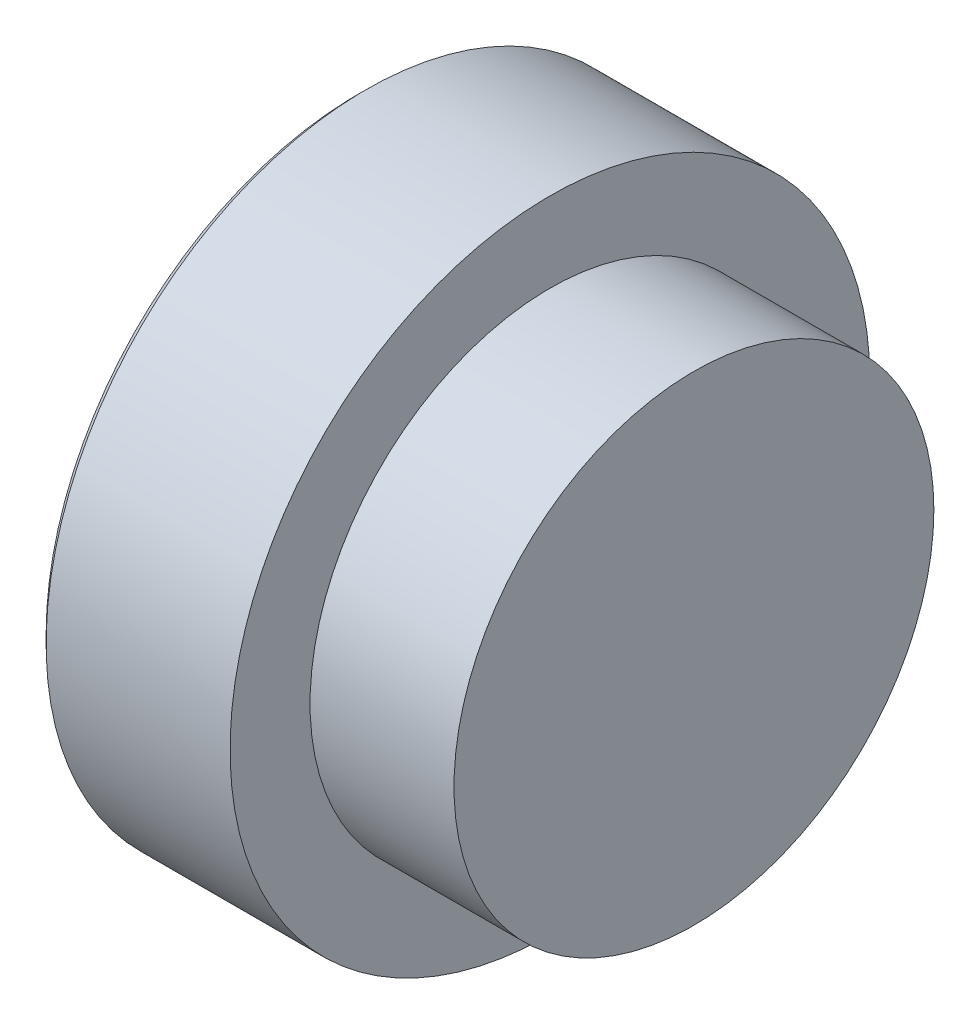
ISO-10303-21;
HEADER;
FILE_DESCRIPTION(('STEP AP214'),'2;1');
FILE_NAME('part.step','',(''),(''),'','','');
FILE_SCHEMA(('AUTOMOTIVE_DESIGN { 1 0 10303 214 1 1 1 1 }'));
ENDSEC;
DATA;
#1=APPLICATION_CONTEXT('core data for automotive mechanical design processes');
#2=APPLICATION_PROTOCOL_DEFINITION('international standard','automotive_design',2000,#1);
#3=PRODUCT_CONTEXT('',#1,'mechanical');
#4=PRODUCT('Part','Part','',(#3));
#5=PRODUCT_RELATED_PRODUCT_CATEGORY('part','',(#4));
#6=PRODUCT_DEFINITION_FORMATION('','',#4);
#7=PRODUCT_DEFINITION_CONTEXT('part definition',#1,'design');
#8=PRODUCT_DEFINITION('design','',#6,#7);
#9=PRODUCT_DEFINITION_SHAPE('','',#8);
#10=(LENGTH_UNIT() NAMED_UNIT(*) SI_UNIT(.MILLI.,.METRE.));
#11=(NAMED_UNIT(*) PLANE_ANGLE_UNIT() SI_UNIT($,.RADIAN.));
#12=(NAMED_UNIT(*) SI_UNIT($,.STERADIAN.) SOLID_ANGLE_UNIT());
#13=UNCERTAINTY_MEASURE_WITH_UNIT(LENGTH_MEASURE(1.E-05),#10,'distance_accuracy_value','');
#14=(GEOMETRIC_REPRESENTATION_CONTEXT(3) GLOBAL_UNCERTAINTY_ASSIGNED_CONTEXT((#13)) GLOBAL_UNIT_ASSIGNED_CONTEXT((#10,
#11,#12)) REPRESENTATION_CONTEXT('',''));
#15=CARTESIAN_POINT('',(0.,0.,0.));
#16=DIRECTION('',(0.,0.,1.));
#17=DIRECTION('',(1.,0.,0.));
#18=AXIS2_PLACEMENT_3D('',#15,#16,#17);
#19=CARTESIAN_POINT('',(21.,0.,0.));
#20=DIRECTION('',(1.,0.,0.));
#21=DIRECTION('',(0.,0.,-1.));
#22=AXIS2_PLACEMENT_3D('',#19,#20,#21);
#23=PLANE('',#22);
#24=CARTESIAN_POINT('',(21.,0.,0.));
#25=DIRECTION('',(1.,0.,0.));
#26=DIRECTION('',(0.,0.,-1.));
#27=AXIS2_PLACEMENT_3D('',#24,#25,#26);
#28=CIRCLE('',#27,15.);
#29=CARTESIAN_POINT('',(21.,0.,-15.));
#30=VERTEX_POINT('',#29);
#31=EDGE_CURVE('E146',#30,#30,#28,.F.);
#32=ORIENTED_EDGE('',*,*,#31,.F.);
#33=EDGE_LOOP('',(#32));
#34=FACE_BOUND('',#33,.T.);
#35=ADVANCED_FACE('F17',(#34),#23,.T.);
#36=CARTESIAN_POINT('',(19.,0.,0.));
#37=DIRECTION('',(1.,0.,0.));
#38=DIRECTION('',(0.,0.,-1.));
#39=AXIS2_PLACEMENT_3D('',#36,#37,#38);
#40=CYLINDRICAL_SURFACE('',#39,15.);
#41=ORIENTED_EDGE('',*,*,#31,.T.);
#42=EDGE_LOOP('',(#41));
#43=FACE_BOUND('',#42,.T.);
#44=CARTESIAN_POINT('',(12.,0.,0.));
#45=DIRECTION('',(1.,0.,0.));
#46=DIRECTION('',(0.,0.,-1.));
#47=AXIS2_PLACEMENT_3D('',#44,#45,#46);
#48=CIRCLE('',#47,15.);
#49=CARTESIAN_POINT('',(12.,0.,-15.));
#50=VERTEX_POINT('',#49);
#51=EDGE_CURVE('E149',#50,#50,#48,.F.);
#52=ORIENTED_EDGE('',*,*,#51,.F.);
#53=EDGE_LOOP('',(#52));
#54=FACE_BOUND('',#53,.T.);
#55=ADVANCED_FACE('F227',(#43,#54),#40,.T.);
#56=CARTESIAN_POINT('',(6.,0.,0.));
#57=DIRECTION('',(1.,0.,0.));
#58=DIRECTION('',(0.,0.,-1.));
#59=AXIS2_PLACEMENT_3D('',#56,#57,#58);
#60=PLANE('',#59);
#61=CARTESIAN_POINT('',(6.,0.,0.));
#62=DIRECTION('',(1.,0.,0.));
#63=DIRECTION('',(0.,0.,-1.));
#64=AXIS2_PLACEMENT_3D('',#61,#62,#63);
#65=CIRCLE('',#64,9.59999999935692);
#66=CARTESIAN_POINT('',(6.,0.0147617041068018,9.59998864998003));
#67=VERTEX_POINT('',#66);
#68=CARTESIAN_POINT('',(6.,0.,-9.59999999943735));
#69=VERTEX_POINT('',#68);
#70=EDGE_CURVE('E157',#67,#69,#65,.F.);
#71=ORIENTED_EDGE('',*,*,#70,.T.);
#72=CARTESIAN_POINT('',(6.,0.,0.));
#73=DIRECTION('',(1.,0.,0.));
#74=DIRECTION('',(0.,0.00153767939403707,0.999998817770342));
#75=AXIS2_PLACEMENT_3D('',#72,#73,#74);
#76=CIRCLE('',#75,9.599999999357);
#77=CARTESIAN_POINT('',(6.,-0.0147617041068025,-9.59998864998003));
#78=VERTEX_POINT('',#77);
#79=EDGE_CURVE('E152',#69,#78,#76,.F.);
#80=ORIENTED_EDGE('',*,*,#79,.T.);
#81=CARTESIAN_POINT('',(6.,0.,0.));
#82=DIRECTION('',(1.,0.,0.));
#83=DIRECTION('',(0.,0.,1.));
#84=AXIS2_PLACEMENT_3D('',#81,#82,#83);
#85=CIRCLE('',#84,9.599999999357);
#86=CARTESIAN_POINT('',(6.,-3.43969491956612E-12,9.59999999943736));
#87=VERTEX_POINT('',#86);
#88=EDGE_CURVE('E56',#78,#87,#85,.F.);
#89=ORIENTED_EDGE('',*,*,#88,.T.);
#90=CARTESIAN_POINT('',(6.,0.,0.));
#91=DIRECTION('',(1.,0.,0.));
#92=DIRECTION('',(0.,-0.00153767939403606,-0.999998817770342));
#93=AXIS2_PLACEMENT_3D('',#90,#91,#92);
#94=CIRCLE('',#93,9.599999999357);
#95=EDGE_CURVE('E205',#87,#67,#94,.F.);
#96=ORIENTED_EDGE('',*,*,#95,.T.);
#97=EDGE_LOOP('',(#71,#80,#89,#96));
#98=FACE_BOUND('',#97,.T.);
#99=ADVANCED_FACE('F219',(#98),#60,.F.);
#100=CARTESIAN_POINT('',(12.,0.,0.));
#101=DIRECTION('',(1.,0.,0.));
#102=DIRECTION('',(0.,0.,-1.));
#103=AXIS2_PLACEMENT_3D('',#100,#101,#102);
#104=PLANE('',#103);
#105=ORIENTED_EDGE('',*,*,#51,.T.);
#106=EDGE_LOOP('',(#105));
#107=FACE_BOUND('',#106,.T.);
#108=CARTESIAN_POINT('',(12.,0.,0.));
#109=DIRECTION('',(1.,0.,0.));
#110=DIRECTION('',(0.,0.,-1.));
#111=AXIS2_PLACEMENT_3D('',#108,#109,#110);
#112=CIRCLE('',#111,20.);
#113=CARTESIAN_POINT('',(12.,0.,-20.));
#114=VERTEX_POINT('',#113);
#115=EDGE_CURVE('E153',#114,#114,#112,.F.);
#116=ORIENTED_EDGE('',*,*,#115,.F.);
#117=EDGE_LOOP('',(#116));
#118=FACE_BOUND('',#117,.T.);
#119=ADVANCED_FACE('F196',(#107,#118),#104,.T.);
#120=CARTESIAN_POINT('',(5.6,0.,0.));
#121=DIRECTION('',(1.,0.,0.));
#122=DIRECTION('',(0.,-0.00153767939403606,-0.999998817770342));
#123=AXIS2_PLACEMENT_3D('',#120,#121,#122);
#124=TOROIDAL_SURFACE('',#123,9.6,0.4);
#125=CARTESIAN_POINT('',(5.6,0.,0.));
#126=DIRECTION('',(1.,0.,0.));
#127=DIRECTION('',(0.,0.,-1.));
#128=AXIS2_PLACEMENT_3D('',#125,#126,#127);
#129=CIRCLE('',#128,10.);
#130=CARTESIAN_POINT('',(5.6,0.,-10.));
#131=VERTEX_POINT('',#130);
#132=EDGE_CURVE('E156',#131,#131,#129,.F.);
#133=ORIENTED_EDGE('',*,*,#132,.T.);
#134=EDGE_LOOP('',(#133));
#135=FACE_BOUND('',#134,.T.);
#136=ORIENTED_EDGE('',*,*,#79,.F.);
#137=ORIENTED_EDGE('',*,*,#70,.F.);
#138=ORIENTED_EDGE('',*,*,#95,.F.);
#139=ORIENTED_EDGE('',*,*,#88,.F.);
#140=EDGE_LOOP('',(#136,#137,#138,#139));
#141=FACE_BOUND('',#140,.T.);
#142=ADVANCED_FACE('F184',(#135,#141),#124,.F.);
#143=CARTESIAN_POINT('',(8.,15.75,0.));
#144=DIRECTION('',(1.,0.,0.));
#145=DIRECTION('',(0.,0.,-1.));
#146=AXIS2_PLACEMENT_3D('',#143,#144,#145);
#147=PLANE('',#146);
#148=CARTESIAN_POINT('',(8.,15.75,0.));
#149=DIRECTION('',(1.,0.,0.));
#150=DIRECTION('',(0.,0.,-1.));
#151=AXIS2_PLACEMENT_3D('',#148,#149,#150);
#152=CIRCLE('',#151,2.5);
#153=CARTESIAN_POINT('',(8.,15.75,-2.5));
#154=VERTEX_POINT('',#153);
#155=EDGE_CURVE('E158',#154,#154,#152,.F.);
#156=ORIENTED_EDGE('',*,*,#155,.T.);
#157=EDGE_LOOP('',(#156));
#158=FACE_BOUND('',#157,.T.);
#159=ADVANCED_FACE('F195',(#158),#147,.F.);
#160=CARTESIAN_POINT('',(0.,0.,0.));
#161=DIRECTION('',(1.,0.,0.));
#162=DIRECTION('',(0.,0.,-1.));
#163=AXIS2_PLACEMENT_3D('',#160,#161,#162);
#164=CYLINDRICAL_SURFACE('',#163,20.);
#165=ORIENTED_EDGE('',*,*,#115,.T.);
#166=EDGE_LOOP('',(#165));
#167=FACE_BOUND('',#166,.T.);
#168=CARTESIAN_POINT('',(0.500000257146541,0.,0.));
#169=DIRECTION('',(1.,0.,0.));
#170=DIRECTION('',(0.,0.,-1.));
#171=AXIS2_PLACEMENT_3D('',#168,#169,#170);
#172=CIRCLE('',#171,19.999999849233);
#173=CARTESIAN_POINT('',(0.50000025714654,0.,-19.9999998492329));
#174=VERTEX_POINT('',#173);
#175=EDGE_CURVE('E161',#174,#174,#172,.F.);
#176=ORIENTED_EDGE('',*,*,#175,.F.);
#177=EDGE_LOOP('',(#176));
#178=FACE_BOUND('',#177,.T.);
#179=ADVANCED_FACE('F308',(#167,#178),#164,.T.);
#180=CARTESIAN_POINT('',(9.99999999999091,-11.13693180369,-11.13693180369));
#181=DIRECTION('',(-1.,0.,0.));
#182=DIRECTION('',(0.,0.,1.));
#183=AXIS2_PLACEMENT_3D('',#180,#181,#182);
#184=CONICAL_SURFACE('',#183,2.06699999998181,1.02974425864171);
#185=CARTESIAN_POINT('',(9.999999999992,-11.13693180369,-11.13693180369));
#186=DIRECTION('',(-1.,0.,0.));
#187=DIRECTION('',(0.,0.,1.));
#188=AXIS2_PLACEMENT_3D('',#185,#186,#187);
#189=CIRCLE('',#188,2.067);
#190=CARTESIAN_POINT('',(9.999999999992,-11.13693180369,-9.06993180369));
#191=VERTEX_POINT('',#190);
#192=EDGE_CURVE('E321',#191,#191,#189,.T.);
#193=ORIENTED_EDGE('',*,*,#192,.T.);
#194=EDGE_LOOP('',(#193));
#195=FACE_BOUND('',#194,.T.);
#196=CARTESIAN_POINT('',(11.2419788995908,-11.13693180369,-11.13693180369));
#197=VERTEX_POINT('',#196);
#198=VERTEX_LOOP('',#197);
#199=FACE_BOUND('',#198,.T.);
#200=ADVANCED_FACE('F305',(#195,#199),#184,.F.);
#201=CARTESIAN_POINT('',(9.99999999999091,-11.13693180369,11.13693180369));
#202=DIRECTION('',(-1.,0.,0.));
#203=DIRECTION('',(0.,0.,1.));
#204=AXIS2_PLACEMENT_3D('',#201,#202,#203);
#205=CONICAL_SURFACE('',#204,2.06699999998181,1.02974425864171);
#206=CARTESIAN_POINT('',(9.999999999992,-11.13693180369,11.13693180369));
#207=DIRECTION('',(-1.,0.,0.));
#208=DIRECTION('',(0.,0.,1.));
#209=AXIS2_PLACEMENT_3D('',#206,#207,#208);
#210=CIRCLE('',#209,2.067);
#211=CARTESIAN_POINT('',(9.999999999992,-11.13693180369,13.20393180369));
#212=VERTEX_POINT('',#211);
#213=EDGE_CURVE('E323',#212,#212,#210,.T.);
#214=ORIENTED_EDGE('',*,*,#213,.T.);
#215=EDGE_LOOP('',(#214));
#216=FACE_BOUND('',#215,.T.);
#217=CARTESIAN_POINT('',(11.2419788995908,-11.13693180369,11.13693180369));
#218=VERTEX_POINT('',#217);
#219=VERTEX_LOOP('',#218);
#220=FACE_BOUND('',#219,.T.);
#221=ADVANCED_FACE('F301',(#216,#220),#205,.F.);
#222=CARTESIAN_POINT('',(10.0000000000477,11.13693180369,11.13693180369));
#223=DIRECTION('',(-1.,0.,0.));
#224=DIRECTION('',(0.,0.,1.));
#225=AXIS2_PLACEMENT_3D('',#222,#223,#224);
#226=CONICAL_SURFACE('',#225,2.0669999998695,1.02974425860179);
#227=CARTESIAN_POINT('',(9.999999999992,11.13693180369,11.13693180369));
#228=DIRECTION('',(-1.,0.,0.));
#229=DIRECTION('',(0.,0.,1.));
#230=AXIS2_PLACEMENT_3D('',#227,#228,#229);
#231=CIRCLE('',#230,2.067);
#232=CARTESIAN_POINT('',(9.999999999992,11.13693180369,13.20393180369));
#233=VERTEX_POINT('',#232);
#234=EDGE_CURVE('E328',#233,#233,#231,.T.);
#235=ORIENTED_EDGE('',*,*,#234,.T.);
#236=EDGE_LOOP('',(#235));
#237=FACE_BOUND('',#236,.T.);
#238=CARTESIAN_POINT('',(11.2419788995055,11.1369318037475,11.13693180369));
#239=VERTEX_POINT('',#238);
#240=VERTEX_LOOP('',#239);
#241=FACE_BOUND('',#240,.T.);
#242=ADVANCED_FACE('F297',(#237,#241),#226,.F.);
#243=CARTESIAN_POINT('',(-1.9,0.,0.));
#244=DIRECTION('',(1.,0.,0.));
#245=DIRECTION('',(0.,0.,-1.));
#246=AXIS2_PLACEMENT_3D('',#243,#244,#245);
#247=CYLINDRICAL_SURFACE('',#246,10.);
#248=CARTESIAN_POINT('',(0.499999915248075,0.,0.));
#249=DIRECTION('',(-1.,0.,0.));
#250=DIRECTION('',(0.,0.,-1.));
#251=AXIS2_PLACEMENT_3D('',#248,#249,#250);
#252=CIRCLE('',#251,9.99999993737939);
#253=CARTESIAN_POINT('',(0.499999915248076,0.,-9.9999999373794));
#254=VERTEX_POINT('',#253);
#255=EDGE_CURVE('E331',#254,#254,#252,.T.);
#256=ORIENTED_EDGE('',*,*,#255,.T.);
#257=EDGE_LOOP('',(#256));
#258=FACE_BOUND('',#257,.T.);
#259=ORIENTED_EDGE('',*,*,#132,.F.);
#260=EDGE_LOOP('',(#259));
#261=FACE_BOUND('',#260,.T.);
#262=ADVANCED_FACE('F293',(#258,#261),#247,.F.);
#263=CARTESIAN_POINT('',(10.0000000000477,11.13693180369,-11.13693180369));
#264=DIRECTION('',(-1.,0.,0.));
#265=DIRECTION('',(0.,0.,1.));
#266=AXIS2_PLACEMENT_3D('',#263,#264,#265);
#267=CONICAL_SURFACE('',#266,2.0669999998695,1.02974425860179);
#268=CARTESIAN_POINT('',(9.999999999992,11.13693180369,-11.13693180369));
#269=DIRECTION('',(-1.,0.,0.));
#270=DIRECTION('',(0.,0.,1.));
#271=AXIS2_PLACEMENT_3D('',#268,#269,#270);
#272=CIRCLE('',#271,2.067);
#273=CARTESIAN_POINT('',(9.999999999992,11.13693180369,-9.06993180369));
#274=VERTEX_POINT('',#273);
#275=EDGE_CURVE('E334',#274,#274,#272,.T.);
#276=ORIENTED_EDGE('',*,*,#275,.T.);
#277=EDGE_LOOP('',(#276));
#278=FACE_BOUND('',#277,.T.);
#279=CARTESIAN_POINT('',(11.2419788995055,11.1369318037475,-11.13693180369));
#280=VERTEX_POINT('',#279);
#281=VERTEX_LOOP('',#280);
#282=FACE_BOUND('',#281,.T.);
#283=ADVANCED_FACE('F289',(#278,#282),#267,.F.);
#284=CARTESIAN_POINT('',(0.,15.75,0.));
#285=DIRECTION('',(1.,0.,0.));
#286=DIRECTION('',(0.,0.,-1.));
#287=AXIS2_PLACEMENT_3D('',#284,#285,#286);
#288=CYLINDRICAL_SURFACE('',#287,2.5);
#289=ORIENTED_EDGE('',*,*,#155,.F.);
#290=EDGE_LOOP('',(#289));
#291=FACE_BOUND('',#290,.T.);
#292=CARTESIAN_POINT('',(0.499999026772002,15.75,0.));
#293=DIRECTION('',(-1.,0.,0.));
#294=DIRECTION('',(0.,0.,-1.));
#295=AXIS2_PLACEMENT_3D('',#292,#293,#294);
#296=CIRCLE('',#295,2.49999910448651);
#297=CARTESIAN_POINT('',(0.499999026772002,15.75,-2.49999910448651));
#298=VERTEX_POINT('',#297);
#299=EDGE_CURVE('E166',#298,#298,#296,.T.);
#300=ORIENTED_EDGE('',*,*,#299,.T.);
#301=EDGE_LOOP('',(#300));
#302=FACE_BOUND('',#301,.T.);
#303=ADVANCED_FACE('F285',(#291,#302),#288,.F.);
#304=CARTESIAN_POINT('',(0.50000025714654,0.,0.));
#305=DIRECTION('',(1.,0.,0.));
#306=DIRECTION('',(0.,0.,-1.));
#307=AXIS2_PLACEMENT_3D('',#304,#305,#306);
#308=CONICAL_SURFACE('',#307,19.999999849233,0.785398153199166);
#309=ORIENTED_EDGE('',*,*,#175,.T.);
#310=EDGE_LOOP('',(#309));
#311=FACE_BOUND('',#310,.T.);
#312=CARTESIAN_POINT('',(1.95997953977845E-07,0.,0.));
#313=DIRECTION('',(1.,0.,0.));
#314=DIRECTION('',(0.,0.,-1.));
#315=AXIS2_PLACEMENT_3D('',#312,#313,#314);
#316=CIRCLE('',#315,19.4999997982826);
#317=CARTESIAN_POINT('',(1.95997953977845E-07,0.,-19.4999997982827));
#318=VERTEX_POINT('',#317);
#319=EDGE_CURVE('E162',#318,#318,#316,.T.);
#320=ORIENTED_EDGE('',*,*,#319,.T.);
#321=EDGE_LOOP('',(#320));
#322=FACE_BOUND('',#321,.T.);
#323=ADVANCED_FACE('F281',(#311,#322),#308,.T.);
#324=CARTESIAN_POINT('',(11.80407784451,-11.13693180369,-11.13693180369));
#325=DIRECTION('',(-1.,0.,0.));
#326=DIRECTION('',(0.,0.,1.));
#327=AXIS2_PLACEMENT_3D('',#324,#325,#326);
#328=CYLINDRICAL_SURFACE('',#327,2.067);
#329=ORIENTED_EDGE('',*,*,#192,.F.);
#330=EDGE_LOOP('',(#329));
#331=FACE_BOUND('',#330,.T.);
#332=CARTESIAN_POINT('',(0.,-11.13693180369,-11.13693180369));
#333=DIRECTION('',(-1.,0.,0.));
#334=DIRECTION('',(0.,0.,1.));
#335=AXIS2_PLACEMENT_3D('',#332,#333,#334);
#336=CIRCLE('',#335,2.067);
#337=CARTESIAN_POINT('',(0.,-11.13693180369,-9.06993180369));
#338=VERTEX_POINT('',#337);
#339=EDGE_CURVE('E165',#338,#338,#336,.T.);
#340=ORIENTED_EDGE('',*,*,#339,.T.);
#341=EDGE_LOOP('',(#340));
#342=FACE_BOUND('',#341,.T.);
#343=ADVANCED_FACE('F277',(#331,#342),#328,.F.);
#344=CARTESIAN_POINT('',(11.80407784451,-11.13693180369,11.13693180369));
#345=DIRECTION('',(-1.,0.,0.));
#346=DIRECTION('',(0.,0.,1.));
#347=AXIS2_PLACEMENT_3D('',#344,#345,#346);
#348=CYLINDRICAL_SURFACE('',#347,2.067);
#349=ORIENTED_EDGE('',*,*,#213,.F.);
#350=EDGE_LOOP('',(#349));
#351=FACE_BOUND('',#350,.T.);
#352=CARTESIAN_POINT('',(0.,-11.13693180369,11.13693180369));
#353=DIRECTION('',(-1.,0.,0.));
#354=DIRECTION('',(0.,0.,1.));
#355=AXIS2_PLACEMENT_3D('',#352,#353,#354);
#356=CIRCLE('',#355,2.067);
#357=CARTESIAN_POINT('',(0.,-11.13693180369,13.20393180369));
#358=VERTEX_POINT('',#357);
#359=EDGE_CURVE('E169',#358,#358,#356,.T.);
#360=ORIENTED_EDGE('',*,*,#359,.T.);
#361=EDGE_LOOP('',(#360));
#362=FACE_BOUND('',#361,.T.);
#363=ADVANCED_FACE('F273',(#351,#362),#348,.F.);
#364=CARTESIAN_POINT('',(11.80407784451,11.13693180369,11.13693180369));
#365=DIRECTION('',(-1.,0.,0.));
#366=DIRECTION('',(0.,0.,1.));
#367=AXIS2_PLACEMENT_3D('',#364,#365,#366);
#368=CYLINDRICAL_SURFACE('',#367,2.067);
#369=ORIENTED_EDGE('',*,*,#234,.F.);
#370=EDGE_LOOP('',(#369));
#371=FACE_BOUND('',#370,.T.);
#372=CARTESIAN_POINT('',(0.,11.13693180369,11.13693180369));
#373=DIRECTION('',(-1.,0.,0.));
#374=DIRECTION('',(0.,0.,1.));
#375=AXIS2_PLACEMENT_3D('',#372,#373,#374);
#376=CIRCLE('',#375,2.067);
#377=CARTESIAN_POINT('',(0.,11.13693180369,13.20393180369));
#378=VERTEX_POINT('',#377);
#379=EDGE_CURVE('E172',#378,#378,#376,.T.);
#380=ORIENTED_EDGE('',*,*,#379,.T.);
#381=EDGE_LOOP('',(#380));
#382=FACE_BOUND('',#381,.T.);
#383=ADVANCED_FACE('F269',(#371,#382),#368,.F.);
#384=CARTESIAN_POINT('',(-6.57815723008499E-08,0.,0.));
#385=DIRECTION('',(-1.,0.,0.));
#386=DIRECTION('',(0.,0.,1.));
#387=AXIS2_PLACEMENT_3D('',#384,#385,#386);
#388=CONICAL_SURFACE('',#387,10.4999999110401,0.78539815602852);
#389=ORIENTED_EDGE('',*,*,#255,.F.);
#390=EDGE_LOOP('',(#389));
#391=FACE_BOUND('',#390,.T.);
#392=CARTESIAN_POINT('',(-6.57815295290742E-08,0.,0.));
#393=DIRECTION('',(-1.,0.,0.));
#394=DIRECTION('',(0.,0.,1.));
#395=AXIS2_PLACEMENT_3D('',#392,#393,#394);
#396=CIRCLE('',#395,10.4999999110401);
#397=CARTESIAN_POINT('',(-6.57815295290742E-08,0.,10.4999999110402));
#398=VERTEX_POINT('',#397);
#399=EDGE_CURVE('E175',#398,#398,#396,.T.);
#400=ORIENTED_EDGE('',*,*,#399,.T.);
#401=EDGE_LOOP('',(#400));
#402=FACE_BOUND('',#401,.T.);
#403=ADVANCED_FACE('F265',(#391,#402),#388,.F.);
#404=CARTESIAN_POINT('',(11.80407784451,11.13693180369,-11.13693180369));
#405=DIRECTION('',(-1.,0.,0.));
#406=DIRECTION('',(0.,0.,1.));
#407=AXIS2_PLACEMENT_3D('',#404,#405,#406);
#408=CYLINDRICAL_SURFACE('',#407,2.067);
#409=ORIENTED_EDGE('',*,*,#275,.F.);
#410=EDGE_LOOP('',(#409));
#411=FACE_BOUND('',#410,.T.);
#412=CARTESIAN_POINT('',(0.,11.13693180369,-11.13693180369));
#413=DIRECTION('',(-1.,0.,0.));
#414=DIRECTION('',(0.,0.,1.));
#415=AXIS2_PLACEMENT_3D('',#412,#413,#414);
#416=CIRCLE('',#415,2.067);
#417=CARTESIAN_POINT('',(0.,11.13693180369,-9.06993180369));
#418=VERTEX_POINT('',#417);
#419=EDGE_CURVE('E28',#418,#418,#416,.T.);
#420=ORIENTED_EDGE('',*,*,#419,.T.);
#421=EDGE_LOOP('',(#420));
#422=FACE_BOUND('',#421,.T.);
#423=ADVANCED_FACE('F254',(#411,#422),#408,.F.);
#424=CARTESIAN_POINT('',(-1.0747385204013E-06,15.75,0.));
#425=DIRECTION('',(-1.,0.,0.));
#426=DIRECTION('',(0.,0.,1.));
#427=AXIS2_PLACEMENT_3D('',#424,#425,#426);
#428=CONICAL_SURFACE('',#427,2.99999883225155,0.785397789651906);
#429=ORIENTED_EDGE('',*,*,#299,.F.);
#430=EDGE_LOOP('',(#429));
#431=FACE_BOUND('',#430,.T.);
#432=CARTESIAN_POINT('',(0.,15.75,0.));
#433=DIRECTION('',(1.,0.,0.));
#434=DIRECTION('',(0.,0.,-1.));
#435=AXIS2_PLACEMENT_3D('',#432,#433,#434);
#436=CIRCLE('',#435,2.99999775751383);
#437=CARTESIAN_POINT('',(0.,15.75,-2.99999775751383));
#438=VERTEX_POINT('',#437);
#439=EDGE_CURVE('E11',#438,#438,#436,.F.);
#440=ORIENTED_EDGE('',*,*,#439,.T.);
#441=EDGE_LOOP('',(#440));
#442=FACE_BOUND('',#441,.T.);
#443=ADVANCED_FACE('F246',(#431,#442),#428,.F.);
#444=CARTESIAN_POINT('',(0.,0.,0.));
#445=DIRECTION('',(1.,0.,0.));
#446=DIRECTION('',(0.,0.,-1.));
#447=AXIS2_PLACEMENT_3D('',#444,#445,#446);
#448=PLANE('',#447);
#449=ORIENTED_EDGE('',*,*,#439,.F.);
#450=EDGE_LOOP('',(#449));
#451=FACE_BOUND('',#450,.T.);
#452=ORIENTED_EDGE('',*,*,#419,.F.);
#453=EDGE_LOOP('',(#452));
#454=FACE_BOUND('',#453,.T.);
#455=ORIENTED_EDGE('',*,*,#399,.F.);
#456=EDGE_LOOP('',(#455));
#457=FACE_BOUND('',#456,.T.);
#458=ORIENTED_EDGE('',*,*,#379,.F.);
#459=EDGE_LOOP('',(#458));
#460=FACE_BOUND('',#459,.T.);
#461=ORIENTED_EDGE('',*,*,#359,.F.);
#462=EDGE_LOOP('',(#461));
#463=FACE_BOUND('',#462,.T.);
#464=ORIENTED_EDGE('',*,*,#339,.F.);
#465=EDGE_LOOP('',(#464));
#466=FACE_BOUND('',#465,.T.);
#467=ORIENTED_EDGE('',*,*,#319,.F.);
#468=EDGE_LOOP('',(#467));
#469=FACE_BOUND('',#468,.T.);
#470=ADVANCED_FACE('F244',(#451,#454,#457,#460,#463,#466,#469),#448,.F.);
#471=CLOSED_SHELL('',(#35,#55,#99,#119,#142,#159,#179,#200,#221,#242,#262,#283,#303,#323,#343,
#363,#383,#403,#423,#443,#470));
#472=CARTESIAN_POINT('',(9.99999999987722,6.894291116569,6.894291116569));
#473=DIRECTION('',(1.,0.,0.));
#474=DIRECTION('',(0.,0.,-1.));
#475=AXIS2_PLACEMENT_3D('',#472,#473,#474);
#476=CONICAL_SURFACE('',#475,1.62099999988904,1.02974425868292);
#477=CARTESIAN_POINT('',(9.02600493651562,6.89429111656637,6.894291116569));
#478=VERTEX_POINT('',#477);
#479=VERTEX_LOOP('',#478);
#480=FACE_BOUND('',#479,.T.);
#481=CARTESIAN_POINT('',(10.,6.894291116569,6.894291116569));
#482=DIRECTION('',(1.,0.,0.));
#483=DIRECTION('',(0.,0.,-1.));
#484=AXIS2_PLACEMENT_3D('',#481,#482,#483);
#485=CIRCLE('',#484,1.621);
#486=CARTESIAN_POINT('',(10.,6.894291116569,5.273291116569));
#487=VERTEX_POINT('',#486);
#488=EDGE_CURVE('E142',#487,#487,#485,.T.);
#489=ORIENTED_EDGE('',*,*,#488,.T.);
#490=EDGE_LOOP('',(#489));
#491=FACE_BOUND('',#490,.T.);
#492=ADVANCED_FACE('F260',(#480,#491),#476,.F.);
#493=CARTESIAN_POINT('',(8.427305183384,6.894291116569,6.894291116569));
#494=DIRECTION('',(1.,0.,0.));
#495=DIRECTION('',(0.,0.,-1.));
#496=AXIS2_PLACEMENT_3D('',#493,#494,#495);
#497=CYLINDRICAL_SURFACE('',#496,1.621);
#498=ORIENTED_EDGE('',*,*,#488,.F.);
#499=EDGE_LOOP('',(#498));
#500=FACE_BOUND('',#499,.T.);
#501=CARTESIAN_POINT('',(11.7,6.894291116569,6.894291116569));
#502=DIRECTION('',(1.,0.,0.));
#503=DIRECTION('',(0.,0.,-1.));
#504=AXIS2_PLACEMENT_3D('',#501,#502,#503);
#505=CIRCLE('',#504,1.621);
#506=CARTESIAN_POINT('',(11.7,6.894291116569,5.273291116569));
#507=VERTEX_POINT('',#506);
#508=EDGE_CURVE('E143',#507,#507,#505,.T.);
#509=ORIENTED_EDGE('',*,*,#508,.T.);
#510=EDGE_LOOP('',(#509));
#511=FACE_BOUND('',#510,.T.);
#512=ADVANCED_FACE('F442',(#500,#511),#497,.F.);
#513=CARTESIAN_POINT('',(11.7,0.,0.));
#514=DIRECTION('',(1.,0.,0.));
#515=DIRECTION('',(0.,0.,-1.));
#516=AXIS2_PLACEMENT_3D('',#513,#514,#515);
#517=PLANE('',#516);
#518=ORIENTED_EDGE('',*,*,#508,.F.);
#519=EDGE_LOOP('',(#518));
#520=FACE_BOUND('',#519,.T.);
#521=ADVANCED_FACE('F440',(#520),#517,.F.);
#522=CLOSED_SHELL('',(#492,#512,#521));
#523=CARTESIAN_POINT('',(9.99999999999091,9.75,0.));
#524=DIRECTION('',(1.,0.,0.));
#525=DIRECTION('',(0.,0.,-1.));
#526=AXIS2_PLACEMENT_3D('',#523,#524,#525);
#527=CONICAL_SURFACE('',#526,1.62100000000328,1.02974425868292);
#528=CARTESIAN_POINT('',(10.,9.75,0.));
#529=DIRECTION('',(1.,0.,0.));
#530=DIRECTION('',(0.,0.,-1.));
#531=AXIS2_PLACEMENT_3D('',#528,#529,#530);
#532=CIRCLE('',#531,1.621);
#533=CARTESIAN_POINT('',(10.,9.75,-1.621));
#534=VERTEX_POINT('',#533);
#535=EDGE_CURVE('E138',#534,#534,#532,.T.);
#536=ORIENTED_EDGE('',*,*,#535,.T.);
#537=EDGE_LOOP('',(#536));
#538=FACE_BOUND('',#537,.T.);
#539=CARTESIAN_POINT('',(9.0260049364872,9.75000000005366,0.));
#540=VERTEX_POINT('',#539);
#541=VERTEX_LOOP('',#540);
#542=FACE_BOUND('',#541,.T.);
#543=ADVANCED_FACE('F435',(#538,#542),#527,.F.);
#544=CARTESIAN_POINT('',(8.427305183384,9.75,0.));
#545=DIRECTION('',(1.,0.,0.));
#546=DIRECTION('',(0.,0.,-1.));
#547=AXIS2_PLACEMENT_3D('',#544,#545,#546);
#548=CYLINDRICAL_SURFACE('',#547,1.621);
#549=ORIENTED_EDGE('',*,*,#535,.F.);
#550=EDGE_LOOP('',(#549));
#551=FACE_BOUND('',#550,.T.);
#552=CARTESIAN_POINT('',(11.7,9.75,0.));
#553=DIRECTION('',(1.,0.,0.));
#554=DIRECTION('',(0.,0.,-1.));
#555=AXIS2_PLACEMENT_3D('',#552,#553,#554);
#556=CIRCLE('',#555,1.621);
#557=CARTESIAN_POINT('',(11.7,9.75,-1.621));
#558=VERTEX_POINT('',#557);
#559=EDGE_CURVE('E139',#558,#558,#556,.T.);
#560=ORIENTED_EDGE('',*,*,#559,.T.);
#561=EDGE_LOOP('',(#560));
#562=FACE_BOUND('',#561,.T.);
#563=ADVANCED_FACE('F429',(#551,#562),#548,.F.);
#564=CARTESIAN_POINT('',(11.7,0.,0.));
#565=DIRECTION('',(1.,0.,0.));
#566=DIRECTION('',(0.,0.,-1.));
#567=AXIS2_PLACEMENT_3D('',#564,#565,#566);
#568=PLANE('',#567);
#569=ORIENTED_EDGE('',*,*,#559,.F.);
#570=EDGE_LOOP('',(#569));
#571=FACE_BOUND('',#570,.T.);
#572=ADVANCED_FACE('F426',(#571),#568,.F.);
#573=CLOSED_SHELL('',(#543,#563,#572));
#574=CARTESIAN_POINT('',(9.99999999987722,6.894291116569,-6.894291116569));
#575=DIRECTION('',(1.,0.,0.));
#576=DIRECTION('',(0.,0.,-1.));
#577=AXIS2_PLACEMENT_3D('',#574,#575,#576);
#578=CONICAL_SURFACE('',#577,1.62099999988904,1.02974425868292);
#579=CARTESIAN_POINT('',(9.02600493651562,6.89429111656637,-6.894291116569));
#580=VERTEX_POINT('',#579);
#581=VERTEX_LOOP('',#580);
#582=FACE_BOUND('',#581,.T.);
#583=CARTESIAN_POINT('',(10.,6.894291116569,-6.894291116569));
#584=DIRECTION('',(1.,0.,0.));
#585=DIRECTION('',(0.,0.,-1.));
#586=AXIS2_PLACEMENT_3D('',#583,#584,#585);
#587=CIRCLE('',#586,1.621);
#588=CARTESIAN_POINT('',(10.,6.894291116569,-8.515291116569));
#589=VERTEX_POINT('',#588);
#590=EDGE_CURVE('E134',#589,#589,#587,.T.);
#591=ORIENTED_EDGE('',*,*,#590,.T.);
#592=EDGE_LOOP('',(#591));
#593=FACE_BOUND('',#592,.T.);
#594=ADVANCED_FACE('F421',(#582,#593),#578,.F.);
#595=CARTESIAN_POINT('',(8.427305183384,6.894291116569,-6.894291116569));
#596=DIRECTION('',(1.,0.,0.));
#597=DIRECTION('',(0.,0.,-1.));
#598=AXIS2_PLACEMENT_3D('',#595,#596,#597);
#599=CYLINDRICAL_SURFACE('',#598,1.621);
#600=ORIENTED_EDGE('',*,*,#590,.F.);
#601=EDGE_LOOP('',(#600));
#602=FACE_BOUND('',#601,.T.);
#603=CARTESIAN_POINT('',(11.7,6.894291116569,-6.894291116569));
#604=DIRECTION('',(1.,0.,0.));
#605=DIRECTION('',(0.,0.,-1.));
#606=AXIS2_PLACEMENT_3D('',#603,#604,#605);
#607=CIRCLE('',#606,1.621);
#608=CARTESIAN_POINT('',(11.7,6.894291116569,-8.515291116569));
#609=VERTEX_POINT('',#608);
#610=EDGE_CURVE('E135',#609,#609,#607,.T.);
#611=ORIENTED_EDGE('',*,*,#610,.T.);
#612=EDGE_LOOP('',(#611));
#613=FACE_BOUND('',#612,.T.);
#614=ADVANCED_FACE('F415',(#602,#613),#599,.F.);
#615=CARTESIAN_POINT('',(11.7,0.,0.));
#616=DIRECTION('',(1.,0.,0.));
#617=DIRECTION('',(0.,0.,-1.));
#618=AXIS2_PLACEMENT_3D('',#615,#616,#617);
#619=PLANE('',#618);
#620=ORIENTED_EDGE('',*,*,#610,.F.);
#621=EDGE_LOOP('',(#620));
#622=FACE_BOUND('',#621,.T.);
#623=ADVANCED_FACE('F412',(#622),#619,.F.);
#624=CLOSED_SHELL('',(#594,#614,#623));
#625=CARTESIAN_POINT('',(9.99999999987722,0.,-9.75));
#626=DIRECTION('',(1.,0.,0.));
#627=DIRECTION('',(0.,0.,-1.));
#628=AXIS2_PLACEMENT_3D('',#625,#626,#627);
#629=CONICAL_SURFACE('',#628,1.62099999977272,1.02974425850754);
#630=CARTESIAN_POINT('',(10.,0.,-9.75));
#631=DIRECTION('',(1.,0.,0.));
#632=DIRECTION('',(0.,0.,-1.));
#633=AXIS2_PLACEMENT_3D('',#630,#631,#632);
#634=CIRCLE('',#633,1.621);
#635=CARTESIAN_POINT('',(10.,0.,-11.371));
#636=VERTEX_POINT('',#635);
#637=EDGE_CURVE('E130',#636,#636,#634,.T.);
#638=ORIENTED_EDGE('',*,*,#637,.T.);
#639=EDGE_LOOP('',(#638));
#640=FACE_BOUND('',#639,.T.);
#641=CARTESIAN_POINT('',(9.02600493660088,3.41060513164848E-10,-9.75));
#642=VERTEX_POINT('',#641);
#643=VERTEX_LOOP('',#642);
#644=FACE_BOUND('',#643,.T.);
#645=ADVANCED_FACE('F407',(#640,#644),#629,.F.);
#646=CARTESIAN_POINT('',(8.427305183384,0.,-9.75));
#647=DIRECTION('',(1.,0.,0.));
#648=DIRECTION('',(0.,0.,-1.));
#649=AXIS2_PLACEMENT_3D('',#646,#647,#648);
#650=CYLINDRICAL_SURFACE('',#649,1.621);
#651=ORIENTED_EDGE('',*,*,#637,.F.);
#652=EDGE_LOOP('',(#651));
#653=FACE_BOUND('',#652,.T.);
#654=CARTESIAN_POINT('',(11.7,0.,-9.75));
#655=DIRECTION('',(1.,0.,0.));
#656=DIRECTION('',(0.,0.,-1.));
#657=AXIS2_PLACEMENT_3D('',#654,#655,#656);
#658=CIRCLE('',#657,1.621);
#659=CARTESIAN_POINT('',(11.7,0.,-11.371));
#660=VERTEX_POINT('',#659);
#661=EDGE_CURVE('E131',#660,#660,#658,.T.);
#662=ORIENTED_EDGE('',*,*,#661,.T.);
#663=EDGE_LOOP('',(#662));
#664=FACE_BOUND('',#663,.T.);
#665=ADVANCED_FACE('F402',(#653,#664),#650,.F.);
#666=CARTESIAN_POINT('',(11.7,0.,0.));
#667=DIRECTION('',(1.,0.,0.));
#668=DIRECTION('',(0.,0.,-1.));
#669=AXIS2_PLACEMENT_3D('',#666,#667,#668);
#670=PLANE('',#669);
#671=ORIENTED_EDGE('',*,*,#661,.F.);
#672=EDGE_LOOP('',(#671));
#673=FACE_BOUND('',#672,.T.);
#674=ADVANCED_FACE('F399',(#673),#670,.F.);
#675=CLOSED_SHELL('',(#645,#665,#674));
#676=CARTESIAN_POINT('',(9.99999999999091,-6.894291116569,-6.894291116569));
#677=DIRECTION('',(1.,0.,0.));
#678=DIRECTION('',(0.,0.,-1.));
#679=AXIS2_PLACEMENT_3D('',#676,#677,#678);
#680=CONICAL_SURFACE('',#679,1.62100000005431,1.02974425863515);
#681=CARTESIAN_POINT('',(9.0260049364872,-6.89429111650952,-6.894291116569));
#682=VERTEX_POINT('',#681);
#683=VERTEX_LOOP('',#682);
#684=FACE_BOUND('',#683,.T.);
#685=CARTESIAN_POINT('',(10.,-6.894291116569,-6.894291116569));
#686=DIRECTION('',(1.,0.,0.));
#687=DIRECTION('',(0.,0.,-1.));
#688=AXIS2_PLACEMENT_3D('',#685,#686,#687);
#689=CIRCLE('',#688,1.621);
#690=CARTESIAN_POINT('',(10.,-6.894291116569,-8.515291116569));
#691=VERTEX_POINT('',#690);
#692=EDGE_CURVE('E126',#691,#691,#689,.T.);
#693=ORIENTED_EDGE('',*,*,#692,.T.);
#694=EDGE_LOOP('',(#693));
#695=FACE_BOUND('',#694,.T.);
#696=ADVANCED_FACE('F390',(#684,#695),#680,.F.);
#697=CARTESIAN_POINT('',(8.427305183384,-6.894291116569,-6.894291116569));
#698=DIRECTION('',(1.,0.,0.));
#699=DIRECTION('',(0.,0.,-1.));
#700=AXIS2_PLACEMENT_3D('',#697,#698,#699);
#701=CYLINDRICAL_SURFACE('',#700,1.621);
#702=ORIENTED_EDGE('',*,*,#692,.F.);
#703=EDGE_LOOP('',(#702));
#704=FACE_BOUND('',#703,.T.);
#705=CARTESIAN_POINT('',(11.7,-6.894291116569,-6.894291116569));
#706=DIRECTION('',(1.,0.,0.));
#707=DIRECTION('',(0.,0.,-1.));
#708=AXIS2_PLACEMENT_3D('',#705,#706,#707);
#709=CIRCLE('',#708,1.621);
#710=CARTESIAN_POINT('',(11.7,-6.894291116569,-8.515291116569));
#711=VERTEX_POINT('',#710);
#712=EDGE_CURVE('E127',#711,#711,#709,.T.);
#713=ORIENTED_EDGE('',*,*,#712,.T.);
#714=EDGE_LOOP('',(#713));
#715=FACE_BOUND('',#714,.T.);
#716=ADVANCED_FACE('F381',(#704,#715),#701,.F.);
#717=CARTESIAN_POINT('',(11.7,0.,0.));
#718=DIRECTION('',(1.,0.,0.));
#719=DIRECTION('',(0.,0.,-1.));
#720=AXIS2_PLACEMENT_3D('',#717,#718,#719);
#721=PLANE('',#720);
#722=ORIENTED_EDGE('',*,*,#712,.F.);
#723=EDGE_LOOP('',(#722));
#724=FACE_BOUND('',#723,.T.);
#725=ADVANCED_FACE('F379',(#724),#721,.F.);
#726=CLOSED_SHELL('',(#696,#716,#725));
#727=CARTESIAN_POINT('',(9.99999999999091,-9.75,0.));
#728=DIRECTION('',(1.,0.,0.));
#729=DIRECTION('',(0.,0.,-1.));
#730=AXIS2_PLACEMENT_3D('',#727,#728,#729);
#731=CONICAL_SURFACE('',#730,1.62100000005375,1.02974425868812);
#732=CARTESIAN_POINT('',(10.,-9.75,0.));
#733=DIRECTION('',(1.,0.,0.));
#734=DIRECTION('',(0.,0.,-1.));
#735=AXIS2_PLACEMENT_3D('',#732,#733,#734);
#736=CIRCLE('',#735,1.621);
#737=CARTESIAN_POINT('',(10.,-9.75,-1.621));
#738=VERTEX_POINT('',#737);
#739=EDGE_CURVE('E122',#738,#738,#736,.T.);
#740=ORIENTED_EDGE('',*,*,#739,.T.);
#741=EDGE_LOOP('',(#740));
#742=FACE_BOUND('',#741,.T.);
#743=CARTESIAN_POINT('',(9.02600493654404,-9.7499999999684,0.));
#744=VERTEX_POINT('',#743);
#745=VERTEX_LOOP('',#744);
#746=FACE_BOUND('',#745,.T.);
#747=ADVANCED_FACE('F352',(#742,#746),#731,.F.);
#748=CARTESIAN_POINT('',(8.427305183384,-9.75,0.));
#749=DIRECTION('',(1.,0.,0.));
#750=DIRECTION('',(0.,0.,-1.));
#751=AXIS2_PLACEMENT_3D('',#748,#749,#750);
#752=CYLINDRICAL_SURFACE('',#751,1.621);
#753=ORIENTED_EDGE('',*,*,#739,.F.);
#754=EDGE_LOOP('',(#753));
#755=FACE_BOUND('',#754,.T.);
#756=CARTESIAN_POINT('',(11.7,-9.75,0.));
#757=DIRECTION('',(1.,0.,0.));
#758=DIRECTION('',(0.,0.,-1.));
#759=AXIS2_PLACEMENT_3D('',#756,#757,#758);
#760=CIRCLE('',#759,1.621);
#761=CARTESIAN_POINT('',(11.7,-9.75,-1.621));
#762=VERTEX_POINT('',#761);
#763=EDGE_CURVE('E123',#762,#762,#760,.T.);
#764=ORIENTED_EDGE('',*,*,#763,.T.);
#765=EDGE_LOOP('',(#764));
#766=FACE_BOUND('',#765,.T.);
#767=ADVANCED_FACE('F355',(#755,#766),#752,.F.);
#768=CARTESIAN_POINT('',(11.7,0.,0.));
#769=DIRECTION('',(1.,0.,0.));
#770=DIRECTION('',(0.,0.,-1.));
#771=AXIS2_PLACEMENT_3D('',#768,#769,#770);
#772=PLANE('',#771);
#773=ORIENTED_EDGE('',*,*,#763,.F.);
#774=EDGE_LOOP('',(#773));
#775=FACE_BOUND('',#774,.T.);
#776=ADVANCED_FACE('F358',(#775),#772,.F.);
#777=CLOSED_SHELL('',(#747,#767,#776));
#778=CARTESIAN_POINT('',(9.99999999999091,-6.894291116569,6.894291116569));
#779=DIRECTION('',(1.,0.,0.));
#780=DIRECTION('',(0.,0.,-1.));
#781=AXIS2_PLACEMENT_3D('',#778,#779,#780);
#782=CONICAL_SURFACE('',#781,1.62100000005431,1.02974425863515);
#783=CARTESIAN_POINT('',(9.0260049364872,-6.89429111650952,6.894291116569));
#784=VERTEX_POINT('',#783);
#785=VERTEX_LOOP('',#784);
#786=FACE_BOUND('',#785,.T.);
#787=CARTESIAN_POINT('',(10.,-6.894291116569,6.894291116569));
#788=DIRECTION('',(1.,0.,0.));
#789=DIRECTION('',(0.,0.,-1.));
#790=AXIS2_PLACEMENT_3D('',#787,#788,#789);
#791=CIRCLE('',#790,1.621);
#792=CARTESIAN_POINT('',(10.,-6.894291116569,5.273291116569));
#793=VERTEX_POINT('',#792);
#794=EDGE_CURVE('E112',#793,#793,#791,.T.);
#795=ORIENTED_EDGE('',*,*,#794,.T.);
#796=EDGE_LOOP('',(#795));
#797=FACE_BOUND('',#796,.T.);
#798=ADVANCED_FACE('F566',(#786,#797),#782,.F.);
#799=CARTESIAN_POINT('',(8.427305183384,-6.894291116569,6.894291116569));
#800=DIRECTION('',(1.,0.,0.));
#801=DIRECTION('',(0.,0.,-1.));
#802=AXIS2_PLACEMENT_3D('',#799,#800,#801);
#803=CYLINDRICAL_SURFACE('',#802,1.621);
#804=ORIENTED_EDGE('',*,*,#794,.F.);
#805=EDGE_LOOP('',(#804));
#806=FACE_BOUND('',#805,.T.);
#807=CARTESIAN_POINT('',(11.7,-6.894291116569,6.894291116569));
#808=DIRECTION('',(1.,0.,0.));
#809=DIRECTION('',(0.,0.,-1.));
#810=AXIS2_PLACEMENT_3D('',#807,#808,#809);
#811=CIRCLE('',#810,1.621);
#812=CARTESIAN_POINT('',(11.7,-6.894291116569,5.273291116569));
#813=VERTEX_POINT('',#812);
#814=EDGE_CURVE('E116',#813,#813,#811,.T.);
#815=ORIENTED_EDGE('',*,*,#814,.T.);
#816=EDGE_LOOP('',(#815));
#817=FACE_BOUND('',#816,.T.);
#818=ADVANCED_FACE('F569',(#806,#817),#803,.F.);
#819=CARTESIAN_POINT('',(11.7,0.,0.));
#820=DIRECTION('',(1.,0.,0.));
#821=DIRECTION('',(0.,0.,-1.));
#822=AXIS2_PLACEMENT_3D('',#819,#820,#821);
#823=PLANE('',#822);
#824=ORIENTED_EDGE('',*,*,#814,.F.);
#825=EDGE_LOOP('',(#824));
#826=FACE_BOUND('',#825,.T.);
#827=ADVANCED_FACE('F578',(#826),#823,.F.);
#828=CLOSED_SHELL('',(#798,#818,#827));
#829=CARTESIAN_POINT('',(9.99999999987722,0.,9.75));
#830=DIRECTION('',(1.,0.,0.));
#831=DIRECTION('',(0.,0.,-1.));
#832=AXIS2_PLACEMENT_3D('',#829,#830,#831);
#833=CONICAL_SURFACE('',#832,1.62099999977272,1.02974425850754);
#834=CARTESIAN_POINT('',(10.,0.,9.75));
#835=DIRECTION('',(1.,0.,0.));
#836=DIRECTION('',(0.,0.,-1.));
#837=AXIS2_PLACEMENT_3D('',#834,#835,#836);
#838=CIRCLE('',#837,1.621);
#839=CARTESIAN_POINT('',(10.,0.,8.129));
#840=VERTEX_POINT('',#839);
#841=EDGE_CURVE('E113',#840,#840,#838,.T.);
#842=ORIENTED_EDGE('',*,*,#841,.T.);
#843=EDGE_LOOP('',(#842));
#844=FACE_BOUND('',#843,.T.);
#845=CARTESIAN_POINT('',(9.02600493660088,3.41060513164848E-10,9.75));
#846=VERTEX_POINT('',#845);
#847=VERTEX_LOOP('',#846);
#848=FACE_BOUND('',#847,.T.);
#849=ADVANCED_FACE('F82',(#844,#848),#833,.F.);
#850=CARTESIAN_POINT('',(8.427305183384,0.,9.75));
#851=DIRECTION('',(1.,0.,0.));
#852=DIRECTION('',(0.,0.,-1.));
#853=AXIS2_PLACEMENT_3D('',#850,#851,#852);
#854=CYLINDRICAL_SURFACE('',#853,1.621);
#855=ORIENTED_EDGE('',*,*,#841,.F.);
#856=EDGE_LOOP('',(#855));
#857=FACE_BOUND('',#856,.T.);
#858=CARTESIAN_POINT('',(11.7,0.,9.75));
#859=DIRECTION('',(1.,0.,0.));
#860=DIRECTION('',(0.,0.,-1.));
#861=AXIS2_PLACEMENT_3D('',#858,#859,#860);
#862=CIRCLE('',#861,1.621);
#863=CARTESIAN_POINT('',(11.7,0.,8.129));
#864=VERTEX_POINT('',#863);
#865=EDGE_CURVE('E110',#864,#864,#862,.T.);
#866=ORIENTED_EDGE('',*,*,#865,.T.);
#867=EDGE_LOOP('',(#866));
#868=FACE_BOUND('',#867,.T.);
#869=ADVANCED_FACE('F84',(#857,#868),#854,.F.);
#870=CARTESIAN_POINT('',(11.7,0.,0.));
#871=DIRECTION('',(1.,0.,0.));
#872=DIRECTION('',(0.,0.,-1.));
#873=AXIS2_PLACEMENT_3D('',#870,#871,#872);
#874=PLANE('',#873);
#875=ORIENTED_EDGE('',*,*,#865,.F.);
#876=EDGE_LOOP('',(#875));
#877=FACE_BOUND('',#876,.T.);
#878=ADVANCED_FACE('F95',(#877),#874,.F.);
#879=CLOSED_SHELL('',(#849,#869,#878));
#880=ORIENTED_CLOSED_SHELL('',*,#522,.T.);
#881=ORIENTED_CLOSED_SHELL('',*,#573,.T.);
#882=ORIENTED_CLOSED_SHELL('',*,#624,.T.);
#883=ORIENTED_CLOSED_SHELL('',*,#675,.T.);
#884=ORIENTED_CLOSED_SHELL('',*,#726,.T.);
#885=ORIENTED_CLOSED_SHELL('',*,#777,.T.);
#886=ORIENTED_CLOSED_SHELL('',*,#828,.T.);
#887=ORIENTED_CLOSED_SHELL('',*,#879,.T.);
#888=BREP_WITH_VOIDS('B1',#471,(#880,#881,#882,#883,#884,#885,#886,#887));
#889=ADVANCED_BREP_SHAPE_REPRESENTATION('',(#18,#888),#14);
#890=SHAPE_DEFINITION_REPRESENTATION(#9,#889);
ENDSEC;
END-ISO-10303-21;
